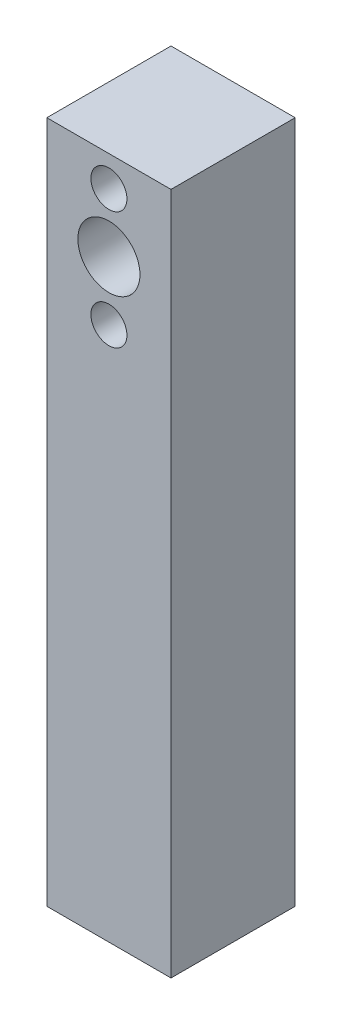
ISO-10303-21;
HEADER;
FILE_DESCRIPTION(('STEP AP214'),'2;1');
FILE_NAME('part.step','',(''),(''),'','','');
FILE_SCHEMA(('AUTOMOTIVE_DESIGN { 1 0 10303 214 1 1 1 1 }'));
ENDSEC;
DATA;
#1=APPLICATION_CONTEXT('core data for automotive mechanical design processes');
#2=APPLICATION_PROTOCOL_DEFINITION('international standard','automotive_design',2000,#1);
#3=PRODUCT_CONTEXT('',#1,'mechanical');
#4=PRODUCT('Part','Part','',(#3));
#5=PRODUCT_RELATED_PRODUCT_CATEGORY('part','',(#4));
#6=PRODUCT_DEFINITION_FORMATION('','',#4);
#7=PRODUCT_DEFINITION_CONTEXT('part definition',#1,'design');
#8=PRODUCT_DEFINITION('design','',#6,#7);
#9=PRODUCT_DEFINITION_SHAPE('','',#8);
#10=(LENGTH_UNIT() NAMED_UNIT(*) SI_UNIT(.MILLI.,.METRE.));
#11=(NAMED_UNIT(*) PLANE_ANGLE_UNIT() SI_UNIT($,.RADIAN.));
#12=(NAMED_UNIT(*) SI_UNIT($,.STERADIAN.) SOLID_ANGLE_UNIT());
#13=UNCERTAINTY_MEASURE_WITH_UNIT(LENGTH_MEASURE(1.E-05),#10,'distance_accuracy_value','');
#14=(GEOMETRIC_REPRESENTATION_CONTEXT(3) GLOBAL_UNCERTAINTY_ASSIGNED_CONTEXT((#13)) GLOBAL_UNIT_ASSIGNED_CONTEXT((#10,
#11,#12)) REPRESENTATION_CONTEXT('',''));
#15=CARTESIAN_POINT('',(0.,0.,0.));
#16=DIRECTION('',(0.,0.,1.));
#17=DIRECTION('',(1.,0.,0.));
#18=AXIS2_PLACEMENT_3D('',#15,#16,#17);
#19=CARTESIAN_POINT('',(0.,0.,12.7));
#20=DIRECTION('',(1.,0.,0.));
#21=DIRECTION('',(0.,0.,-1.));
#22=AXIS2_PLACEMENT_3D('',#19,#20,#21);
#23=PLANE('',#22);
#24=DIRECTION('',(0.,-1.,0.));
#25=VECTOR('',#24,1.);
#26=CARTESIAN_POINT('',(0.,0.,0.));
#27=LINE('',#26,#25);
#28=CARTESIAN_POINT('',(0.,69.85,0.));
#29=VERTEX_POINT('',#28);
#30=CARTESIAN_POINT('',(0.,0.,0.));
#31=VERTEX_POINT('',#30);
#32=EDGE_CURVE('E96',#29,#31,#27,.T.);
#33=ORIENTED_EDGE('',*,*,#32,.T.);
#34=DIRECTION('',(0.,0.,-1.));
#35=VECTOR('',#34,1.);
#36=CARTESIAN_POINT('',(0.,0.,12.7));
#37=LINE('',#36,#35);
#38=CARTESIAN_POINT('',(0.,0.,12.7));
#39=VERTEX_POINT('',#38);
#40=EDGE_CURVE('E11',#39,#31,#37,.T.);
#41=ORIENTED_EDGE('',*,*,#40,.F.);
#42=DIRECTION('',(0.,-1.,0.));
#43=VECTOR('',#42,1.);
#44=CARTESIAN_POINT('',(0.,0.,12.7));
#45=LINE('',#44,#43);
#46=CARTESIAN_POINT('',(0.,69.85,12.7));
#47=VERTEX_POINT('',#46);
#48=EDGE_CURVE('E84',#47,#39,#45,.T.);
#49=ORIENTED_EDGE('',*,*,#48,.F.);
#50=DIRECTION('',(0.,0.,-1.));
#51=VECTOR('',#50,1.);
#52=CARTESIAN_POINT('',(0.,69.85,12.7));
#53=LINE('',#52,#51);
#54=EDGE_CURVE('E92',#47,#29,#53,.T.);
#55=ORIENTED_EDGE('',*,*,#54,.T.);
#56=EDGE_LOOP('',(#33,#41,#49,#55));
#57=FACE_BOUND('',#56,.T.);
#58=ADVANCED_FACE('F33',(#57),#23,.F.);
#59=CARTESIAN_POINT('',(0.,0.,12.7));
#60=DIRECTION('',(0.,1.,0.));
#61=DIRECTION('',(0.,0.,1.));
#62=AXIS2_PLACEMENT_3D('',#59,#60,#61);
#63=PLANE('',#62);
#64=DIRECTION('',(1.,0.,0.));
#65=VECTOR('',#64,1.);
#66=CARTESIAN_POINT('',(0.,0.,0.));
#67=LINE('',#66,#65);
#68=CARTESIAN_POINT('',(12.7,0.,0.));
#69=VERTEX_POINT('',#68);
#70=EDGE_CURVE('E88',#31,#69,#67,.T.);
#71=ORIENTED_EDGE('',*,*,#70,.T.);
#72=DIRECTION('',(0.,0.,-1.));
#73=VECTOR('',#72,1.);
#74=CARTESIAN_POINT('',(12.7,0.,12.7));
#75=LINE('',#74,#73);
#76=CARTESIAN_POINT('',(12.7,0.,12.7));
#77=VERTEX_POINT('',#76);
#78=EDGE_CURVE('E41',#77,#69,#75,.T.);
#79=ORIENTED_EDGE('',*,*,#78,.F.);
#80=DIRECTION('',(1.,0.,0.));
#81=VECTOR('',#80,1.);
#82=CARTESIAN_POINT('',(0.,0.,12.7));
#83=LINE('',#82,#81);
#84=EDGE_CURVE('E79',#39,#77,#83,.T.);
#85=ORIENTED_EDGE('',*,*,#84,.F.);
#86=ORIENTED_EDGE('',*,*,#40,.T.);
#87=EDGE_LOOP('',(#71,#79,#85,#86));
#88=FACE_BOUND('',#87,.T.);
#89=ADVANCED_FACE('F87',(#88),#63,.F.);
#90=CARTESIAN_POINT('',(12.7,0.,12.7));
#91=DIRECTION('',(-1.,0.,0.));
#92=DIRECTION('',(0.,0.,1.));
#93=AXIS2_PLACEMENT_3D('',#90,#91,#92);
#94=PLANE('',#93);
#95=DIRECTION('',(0.,1.,0.));
#96=VECTOR('',#95,1.);
#97=CARTESIAN_POINT('',(12.7,0.,0.));
#98=LINE('',#97,#96);
#99=CARTESIAN_POINT('',(12.7,69.85,0.));
#100=VERTEX_POINT('',#99);
#101=EDGE_CURVE('E66',#69,#100,#98,.T.);
#102=ORIENTED_EDGE('',*,*,#101,.T.);
#103=DIRECTION('',(0.,0.,-1.));
#104=VECTOR('',#103,1.);
#105=CARTESIAN_POINT('',(12.7,69.85,12.7));
#106=LINE('',#105,#104);
#107=CARTESIAN_POINT('',(12.7,69.85,12.7));
#108=VERTEX_POINT('',#107);
#109=EDGE_CURVE('E89',#108,#100,#106,.T.);
#110=ORIENTED_EDGE('',*,*,#109,.F.);
#111=DIRECTION('',(0.,1.,0.));
#112=VECTOR('',#111,1.);
#113=CARTESIAN_POINT('',(12.7,0.,12.7));
#114=LINE('',#113,#112);
#115=EDGE_CURVE('E82',#77,#108,#114,.T.);
#116=ORIENTED_EDGE('',*,*,#115,.F.);
#117=ORIENTED_EDGE('',*,*,#78,.T.);
#118=EDGE_LOOP('',(#102,#110,#116,#117));
#119=FACE_BOUND('',#118,.T.);
#120=ADVANCED_FACE('F90',(#119),#94,.F.);
#121=CARTESIAN_POINT('',(0.,69.85,12.7));
#122=DIRECTION('',(0.,-1.,0.));
#123=DIRECTION('',(0.,0.,-1.));
#124=AXIS2_PLACEMENT_3D('',#121,#122,#123);
#125=PLANE('',#124);
#126=DIRECTION('',(-1.,0.,0.));
#127=VECTOR('',#126,1.);
#128=CARTESIAN_POINT('',(0.,69.85,0.));
#129=LINE('',#128,#127);
#130=EDGE_CURVE('E72',#100,#29,#129,.T.);
#131=ORIENTED_EDGE('',*,*,#130,.T.);
#132=ORIENTED_EDGE('',*,*,#54,.F.);
#133=DIRECTION('',(-1.,0.,0.));
#134=VECTOR('',#133,1.);
#135=CARTESIAN_POINT('',(0.,69.85,12.7));
#136=LINE('',#135,#134);
#137=EDGE_CURVE('E49',#108,#47,#136,.T.);
#138=ORIENTED_EDGE('',*,*,#137,.F.);
#139=ORIENTED_EDGE('',*,*,#109,.T.);
#140=EDGE_LOOP('',(#131,#132,#138,#139));
#141=FACE_BOUND('',#140,.T.);
#142=ADVANCED_FACE('F104',(#141),#125,.F.);
#143=CARTESIAN_POINT('',(0.,0.,12.7));
#144=DIRECTION('',(0.,0.,-1.));
#145=DIRECTION('',(-1.,0.,0.));
#146=AXIS2_PLACEMENT_3D('',#143,#144,#145);
#147=PLANE('',#146);
#148=CARTESIAN_POINT('',(6.35,54.6735,12.7));
#149=DIRECTION('',(0.,0.,1.));
#150=DIRECTION('',(1.,0.,0.));
#151=AXIS2_PLACEMENT_3D('',#148,#149,#150);
#152=CIRCLE('',#151,1.8415);
#153=CARTESIAN_POINT('',(8.1915,54.6735,12.7));
#154=VERTEX_POINT('',#153);
#155=EDGE_CURVE('E122',#154,#154,#152,.T.);
#156=ORIENTED_EDGE('',*,*,#155,.F.);
#157=EDGE_LOOP('',(#156));
#158=FACE_BOUND('',#157,.T.);
#159=CARTESIAN_POINT('',(6.35,66.7385,12.7));
#160=DIRECTION('',(0.,0.,1.));
#161=DIRECTION('',(1.,0.,0.));
#162=AXIS2_PLACEMENT_3D('',#159,#160,#161);
#163=CIRCLE('',#162,1.8415);
#164=CARTESIAN_POINT('',(8.1915,66.7385,12.7));
#165=VERTEX_POINT('',#164);
#166=EDGE_CURVE('E116',#165,#165,#163,.T.);
#167=ORIENTED_EDGE('',*,*,#166,.F.);
#168=EDGE_LOOP('',(#167));
#169=FACE_BOUND('',#168,.T.);
#170=CARTESIAN_POINT('',(6.35,60.706,12.7));
#171=DIRECTION('',(0.,0.,1.));
#172=DIRECTION('',(1.,0.,0.));
#173=AXIS2_PLACEMENT_3D('',#170,#171,#172);
#174=CIRCLE('',#173,3.175);
#175=CARTESIAN_POINT('',(9.525,60.706,12.7));
#176=VERTEX_POINT('',#175);
#177=EDGE_CURVE('E110',#176,#176,#174,.T.);
#178=ORIENTED_EDGE('',*,*,#177,.F.);
#179=EDGE_LOOP('',(#178));
#180=FACE_BOUND('',#179,.T.);
#181=ORIENTED_EDGE('',*,*,#48,.T.);
#182=ORIENTED_EDGE('',*,*,#84,.T.);
#183=ORIENTED_EDGE('',*,*,#115,.T.);
#184=ORIENTED_EDGE('',*,*,#137,.T.);
#185=EDGE_LOOP('',(#181,#182,#183,#184));
#186=FACE_BOUND('',#185,.T.);
#187=ADVANCED_FACE('F80',(#158,#169,#180,#186),#147,.F.);
#188=CARTESIAN_POINT('',(0.,0.,0.));
#189=DIRECTION('',(0.,0.,-1.));
#190=DIRECTION('',(-1.,0.,0.));
#191=AXIS2_PLACEMENT_3D('',#188,#189,#190);
#192=PLANE('',#191);
#193=CARTESIAN_POINT('',(6.35,54.6735,0.));
#194=DIRECTION('',(0.,0.,1.));
#195=DIRECTION('',(1.,0.,0.));
#196=AXIS2_PLACEMENT_3D('',#193,#194,#195);
#197=CIRCLE('',#196,1.8415);
#198=CARTESIAN_POINT('',(8.1915,54.6735,0.));
#199=VERTEX_POINT('',#198);
#200=EDGE_CURVE('E119',#199,#199,#197,.T.);
#201=ORIENTED_EDGE('',*,*,#200,.T.);
#202=EDGE_LOOP('',(#201));
#203=FACE_BOUND('',#202,.T.);
#204=CARTESIAN_POINT('',(6.35,66.7385,0.));
#205=DIRECTION('',(0.,0.,1.));
#206=DIRECTION('',(1.,0.,0.));
#207=AXIS2_PLACEMENT_3D('',#204,#205,#206);
#208=CIRCLE('',#207,1.8415);
#209=CARTESIAN_POINT('',(8.1915,66.7385,0.));
#210=VERTEX_POINT('',#209);
#211=EDGE_CURVE('E113',#210,#210,#208,.T.);
#212=ORIENTED_EDGE('',*,*,#211,.T.);
#213=EDGE_LOOP('',(#212));
#214=FACE_BOUND('',#213,.T.);
#215=CARTESIAN_POINT('',(6.35,60.706,0.));
#216=DIRECTION('',(0.,0.,1.));
#217=DIRECTION('',(1.,0.,0.));
#218=AXIS2_PLACEMENT_3D('',#215,#216,#217);
#219=CIRCLE('',#218,3.175);
#220=CARTESIAN_POINT('',(9.525,60.706,0.));
#221=VERTEX_POINT('',#220);
#222=EDGE_CURVE('E99',#221,#221,#219,.T.);
#223=ORIENTED_EDGE('',*,*,#222,.T.);
#224=EDGE_LOOP('',(#223));
#225=FACE_BOUND('',#224,.T.);
#226=ORIENTED_EDGE('',*,*,#32,.F.);
#227=ORIENTED_EDGE('',*,*,#130,.F.);
#228=ORIENTED_EDGE('',*,*,#101,.F.);
#229=ORIENTED_EDGE('',*,*,#70,.F.);
#230=EDGE_LOOP('',(#226,#227,#228,#229));
#231=FACE_BOUND('',#230,.T.);
#232=ADVANCED_FACE('F107',(#203,#214,#225,#231),#192,.T.);
#233=CARTESIAN_POINT('',(6.35,60.706,0.));
#234=DIRECTION('',(0.,0.,1.));
#235=DIRECTION('',(1.,0.,0.));
#236=AXIS2_PLACEMENT_3D('',#233,#234,#235);
#237=CYLINDRICAL_SURFACE('',#236,3.175);
#238=ORIENTED_EDGE('',*,*,#222,.F.);
#239=EDGE_LOOP('',(#238));
#240=FACE_BOUND('',#239,.T.);
#241=ORIENTED_EDGE('',*,*,#177,.T.);
#242=EDGE_LOOP('',(#241));
#243=FACE_BOUND('',#242,.T.);
#244=ADVANCED_FACE('F144',(#240,#243),#237,.F.);
#245=CARTESIAN_POINT('',(6.35,66.7385,0.));
#246=DIRECTION('',(0.,0.,1.));
#247=DIRECTION('',(1.,0.,0.));
#248=AXIS2_PLACEMENT_3D('',#245,#246,#247);
#249=CYLINDRICAL_SURFACE('',#248,1.8415);
#250=ORIENTED_EDGE('',*,*,#211,.F.);
#251=EDGE_LOOP('',(#250));
#252=FACE_BOUND('',#251,.T.);
#253=ORIENTED_EDGE('',*,*,#166,.T.);
#254=EDGE_LOOP('',(#253));
#255=FACE_BOUND('',#254,.T.);
#256=ADVANCED_FACE('F133',(#252,#255),#249,.F.);
#257=CARTESIAN_POINT('',(6.35,54.6735,0.));
#258=DIRECTION('',(0.,0.,1.));
#259=DIRECTION('',(1.,0.,0.));
#260=AXIS2_PLACEMENT_3D('',#257,#258,#259);
#261=CYLINDRICAL_SURFACE('',#260,1.8415);
#262=ORIENTED_EDGE('',*,*,#200,.F.);
#263=EDGE_LOOP('',(#262));
#264=FACE_BOUND('',#263,.T.);
#265=ORIENTED_EDGE('',*,*,#155,.T.);
#266=EDGE_LOOP('',(#265));
#267=FACE_BOUND('',#266,.T.);
#268=ADVANCED_FACE('F130',(#264,#267),#261,.F.);
#269=CLOSED_SHELL('',(#58,#89,#120,#142,#187,#232,#244,#256,#268));
#270=MANIFOLD_SOLID_BREP('B2',#269);
#271=ADVANCED_BREP_SHAPE_REPRESENTATION('',(#18,#270),#14);
#272=SHAPE_DEFINITION_REPRESENTATION(#9,#271);
ENDSEC;
END-ISO-10303-21;
